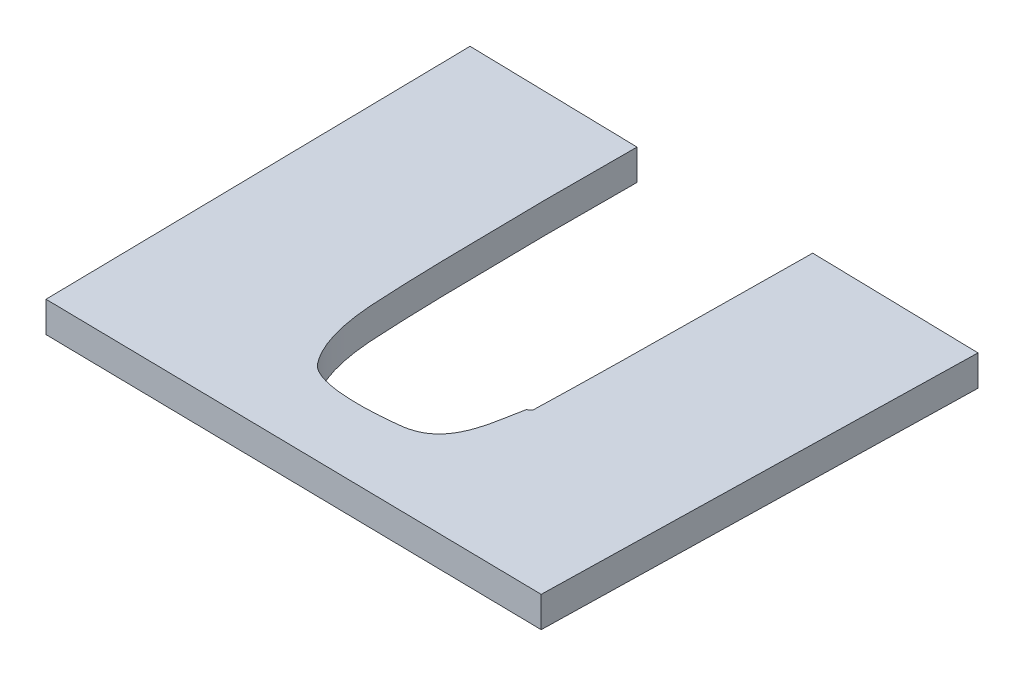
ISO-10303-21;
HEADER;
FILE_DESCRIPTION(('STEP AP214'),'2;1');
FILE_NAME('part.step','',(''),(''),'','','');
FILE_SCHEMA(('AUTOMOTIVE_DESIGN { 1 0 10303 214 1 1 1 1 }'));
ENDSEC;
DATA;
#1=APPLICATION_CONTEXT('core data for automotive mechanical design processes');
#2=APPLICATION_PROTOCOL_DEFINITION('international standard','automotive_design',2000,#1);
#3=PRODUCT_CONTEXT('',#1,'mechanical');
#4=PRODUCT('Part','Part','',(#3));
#5=PRODUCT_RELATED_PRODUCT_CATEGORY('part','',(#4));
#6=PRODUCT_DEFINITION_FORMATION('','',#4);
#7=PRODUCT_DEFINITION_CONTEXT('part definition',#1,'design');
#8=PRODUCT_DEFINITION('design','',#6,#7);
#9=PRODUCT_DEFINITION_SHAPE('','',#8);
#10=(LENGTH_UNIT() NAMED_UNIT(*) SI_UNIT(.MILLI.,.METRE.));
#11=(NAMED_UNIT(*) PLANE_ANGLE_UNIT() SI_UNIT($,.RADIAN.));
#12=(NAMED_UNIT(*) SI_UNIT($,.STERADIAN.) SOLID_ANGLE_UNIT());
#13=UNCERTAINTY_MEASURE_WITH_UNIT(LENGTH_MEASURE(1.E-05),#10,'distance_accuracy_value','');
#14=(GEOMETRIC_REPRESENTATION_CONTEXT(3) GLOBAL_UNCERTAINTY_ASSIGNED_CONTEXT((#13)) GLOBAL_UNIT_ASSIGNED_CONTEXT((#10,
#11,#12)) REPRESENTATION_CONTEXT('',''));
#15=CARTESIAN_POINT('',(0.,0.,0.));
#16=DIRECTION('',(0.,0.,1.));
#17=DIRECTION('',(1.,0.,0.));
#18=AXIS2_PLACEMENT_3D('',#15,#16,#17);
#19=CARTESIAN_POINT('',(88.3389714618213,1.,24.135500369023));
#20=DIRECTION('',(0.999866385580923,0.,-0.0163465894100423));
#21=DIRECTION('',(-0.0163465894100423,0.,-0.999866385580923));
#22=AXIS2_PLACEMENT_3D('',#19,#20,#21);
#23=PLANE('',#22);
#24=DIRECTION('',(0.0163465894100423,0.,0.999866385580923));
#25=VECTOR('',#24,1.);
#26=CARTESIAN_POINT('',(88.3389714618213,1.,24.135500369023));
#27=LINE('',#26,#25);
#28=CARTESIAN_POINT('',(88.1089001034624,1.,10.0628022827376));
#29=VERTEX_POINT('',#28);
#30=CARTESIAN_POINT('',(88.3389714618213,1.,24.135500369023));
#31=VERTEX_POINT('',#30);
#32=EDGE_CURVE('E107',#29,#31,#27,.T.);
#33=ORIENTED_EDGE('',*,*,#32,.F.);
#34=DIRECTION('',(0.,-1.,0.));
#35=VECTOR('',#34,1.);
#36=CARTESIAN_POINT('',(88.1089001034624,1.,10.0628022827376));
#37=LINE('',#36,#35);
#38=CARTESIAN_POINT('',(88.1089001034624,0.,10.0628022827376));
#39=VERTEX_POINT('',#38);
#40=EDGE_CURVE('E94',#29,#39,#37,.T.);
#41=ORIENTED_EDGE('',*,*,#40,.T.);
#42=DIRECTION('',(0.0163465894100423,0.,0.999866385580923));
#43=VECTOR('',#42,1.);
#44=CARTESIAN_POINT('',(88.3389714618213,0.,24.135500369023));
#45=LINE('',#44,#43);
#46=CARTESIAN_POINT('',(88.3389714618213,0.,24.135500369023));
#47=VERTEX_POINT('',#46);
#48=EDGE_CURVE('E102',#39,#47,#45,.T.);
#49=ORIENTED_EDGE('',*,*,#48,.T.);
#50=DIRECTION('',(0.,-1.,0.));
#51=VECTOR('',#50,1.);
#52=CARTESIAN_POINT('',(88.3389714618213,1.,24.135500369023));
#53=LINE('',#52,#51);
#54=EDGE_CURVE('E115',#31,#47,#53,.T.);
#55=ORIENTED_EDGE('',*,*,#54,.F.);
#56=EDGE_LOOP('',(#33,#41,#49,#55));
#57=FACE_BOUND('',#56,.T.);
#58=ADVANCED_FACE('F39',(#57),#23,.F.);
#59=CARTESIAN_POINT('',(62.4947593620138,1.,-34.1363669338565));
#60=DIRECTION('',(0.,1.,0.));
#61=DIRECTION('',(0.,0.,1.));
#62=AXIS2_PLACEMENT_3D('',#59,#60,#61);
#63=PLANE('',#62);
#64=DIRECTION('',(0.99975317783161,0.,0.022216737285147));
#65=VECTOR('',#64,1.);
#66=CARTESIAN_POINT('',(106.088763042082,1.,10.4623547924847));
#67=LINE('',#66,#65);
#68=CARTESIAN_POINT('',(93.6838427640256,1.,10.1866898974168));
#69=VERTEX_POINT('',#68);
#70=EDGE_CURVE('E58',#29,#69,#67,.T.);
#71=ORIENTED_EDGE('',*,*,#70,.F.);
#72=ORIENTED_EDGE('',*,*,#32,.T.);
#73=DIRECTION('',(0.999874047483599,0.,0.0158710166267237));
#74=VECTOR('',#73,1.);
#75=CARTESIAN_POINT('',(104.764673512498,1.,24.3962257983988));
#76=LINE('',#75,#74);
#77=CARTESIAN_POINT('',(104.764673512498,1.,24.3962257983988));
#78=VERTEX_POINT('',#77);
#79=EDGE_CURVE('E118',#31,#78,#76,.T.);
#80=ORIENTED_EDGE('',*,*,#79,.T.);
#81=DIRECTION('',(0.0217339954092151,0.,-0.999763788823916));
#82=VECTOR('',#81,1.);
#83=CARTESIAN_POINT('',(105.155761656561,1.,6.40617117146744));
#84=LINE('',#83,#82);
#85=CARTESIAN_POINT('',(105.06807683688,1.,10.4396728768135));
#86=VERTEX_POINT('',#85);
#87=EDGE_CURVE('E122',#78,#86,#84,.T.);
#88=ORIENTED_EDGE('',*,*,#87,.T.);
#89=CARTESIAN_POINT('',(99.5501649249814,1.,10.3170526121047));
#90=VERTEX_POINT('',#89);
#91=EDGE_CURVE('E112',#90,#86,#67,.T.);
#92=ORIENTED_EDGE('',*,*,#91,.F.);
#93=CARTESIAN_POINT('',(93.6838427640256,1.,10.1866898974168));
#94=CARTESIAN_POINT('',(93.6838427640256,1.,11.359954329608));
#95=CARTESIAN_POINT('',(93.6663333047441,1.,12.5333494221294));
#96=CARTESIAN_POINT('',(93.6838427640256,1.,13.7064831939903));
#97=CARTESIAN_POINT('',(93.7097908086668,1.,15.4450021849541));
#98=CARTESIAN_POINT('',(93.7140616561399,1.,17.1851655235641));
#99=CARTESIAN_POINT('',(93.8142054787135,1.,18.9209917815066));
#100=CARTESIAN_POINT('',(93.8620093253018,1.,19.7495917890368));
#101=CARTESIAN_POINT('',(94.0420349080543,1.,20.8353125017816));
#102=CARTESIAN_POINT('',(94.5963817668409,1.,21.5282460752648));
#103=CARTESIAN_POINT('',(95.1899686480391,1.,22.2702296767625));
#104=CARTESIAN_POINT('',(97.6585200006946,1.,21.9273222495673));
#105=CARTESIAN_POINT('',(97.7250869193507,1.,21.9193342193285));
#106=CARTESIAN_POINT('',(99.0317960926545,1.,21.7625291185321));
#107=CARTESIAN_POINT('',(99.1050513823907,1.,20.3643832063327));
#108=CARTESIAN_POINT('',(99.2894394956056,1.,19.4424426402583));
#109=CARTESIAN_POINT('',(99.3014915328419,1.,19.3821824540767));
#110=CARTESIAN_POINT('',(99.418047110142,1.,19.3735084308724));
#111=CARTESIAN_POINT('',(99.4198022102935,1.,19.3120799255704));
#112=CARTESIAN_POINT('',(99.5054431849838,1.,16.3146458114124));
#113=CARTESIAN_POINT('',(99.5067106867521,1.,13.3153950499266));
#114=CARTESIAN_POINT('',(99.5501649249814,1.,10.3170526121047));
#115=B_SPLINE_CURVE_WITH_KNOTS('',3,(#93,#94,#95,#96,#97,#98,#99,#100,#101,#102,#103,#104,#105,
#106,#107,#108,#109,#110,#111,#112,#113,#114),.UNSPECIFIED.,.F.,.F.,(4,3,3,3,3,3,3,4),(0.,1.,2.,
3.,4.,5.,6.,7.),.UNSPECIFIED.);
#116=EDGE_CURVE('E42',#69,#90,#115,.T.);
#117=ORIENTED_EDGE('',*,*,#116,.F.);
#118=EDGE_LOOP('',(#71,#72,#80,#88,#92,#117));
#119=FACE_BOUND('',#118,.T.);
#120=ADVANCED_FACE('F106',(#119),#63,.T.);
#121=CARTESIAN_POINT('',(62.4947593620138,0.,-34.1363669338565));
#122=DIRECTION('',(0.,1.,0.));
#123=DIRECTION('',(0.,0.,1.));
#124=AXIS2_PLACEMENT_3D('',#121,#122,#123);
#125=PLANE('',#124);
#126=ORIENTED_EDGE('',*,*,#48,.F.);
#127=DIRECTION('',(0.99975317783161,0.,0.022216737285147));
#128=VECTOR('',#127,1.);
#129=CARTESIAN_POINT('',(61.5256831162066,0.,9.47206412746524));
#130=LINE('',#129,#128);
#131=CARTESIAN_POINT('',(93.6838427640256,0.,10.1866898974168));
#132=VERTEX_POINT('',#131);
#133=EDGE_CURVE('E97',#39,#132,#130,.T.);
#134=ORIENTED_EDGE('',*,*,#133,.T.);
#135=CARTESIAN_POINT('',(93.6838427640256,0.,10.1866898974168));
#136=CARTESIAN_POINT('',(93.6838427640256,0.,11.359954329608));
#137=CARTESIAN_POINT('',(93.6663333047441,0.,12.5333494221294));
#138=CARTESIAN_POINT('',(93.6838427640256,0.,13.7064831939903));
#139=CARTESIAN_POINT('',(93.7097908086668,0.,15.4450021849541));
#140=CARTESIAN_POINT('',(93.7140616561399,0.,17.1851655235641));
#141=CARTESIAN_POINT('',(93.8142054787135,0.,18.9209917815066));
#142=CARTESIAN_POINT('',(93.8620093253018,0.,19.7495917890368));
#143=CARTESIAN_POINT('',(94.0420349080543,0.,20.8353125017816));
#144=CARTESIAN_POINT('',(94.5963817668409,0.,21.5282460752648));
#145=CARTESIAN_POINT('',(95.1899686480391,0.,22.2702296767625));
#146=CARTESIAN_POINT('',(97.6585200006946,0.,21.9273222495673));
#147=CARTESIAN_POINT('',(97.7250869193507,0.,21.9193342193285));
#148=CARTESIAN_POINT('',(99.0317960926545,0.,21.7625291185321));
#149=CARTESIAN_POINT('',(99.1050513823907,0.,20.3643832063327));
#150=CARTESIAN_POINT('',(99.2894394956056,0.,19.4424426402583));
#151=CARTESIAN_POINT('',(99.3014915328419,0.,19.3821824540767));
#152=CARTESIAN_POINT('',(99.418047110142,0.,19.3735084308724));
#153=CARTESIAN_POINT('',(99.4198022102935,0.,19.3120799255704));
#154=CARTESIAN_POINT('',(99.5054431849838,0.,16.3146458114124));
#155=CARTESIAN_POINT('',(99.5067106867521,0.,13.3153950499266));
#156=CARTESIAN_POINT('',(99.5501649249814,0.,10.3170526121047));
#157=B_SPLINE_CURVE_WITH_KNOTS('',3,(#135,#136,#137,#138,#139,#140,#141,#142,#143,#144,#145,
#146,#147,#148,#149,#150,#151,#152,#153,#154,#155,#156),.UNSPECIFIED.,.F.,.F.,(4,3,3,3,3,3,3,4),
(0.,1.,2.,3.,4.,5.,6.,7.),.UNSPECIFIED.);
#158=CARTESIAN_POINT('',(99.5501649249814,0.,10.3170526121047));
#159=VERTEX_POINT('',#158);
#160=EDGE_CURVE('E128',#132,#159,#157,.T.);
#161=ORIENTED_EDGE('',*,*,#160,.T.);
#162=CARTESIAN_POINT('',(105.06807683688,0.,10.4396728768135));
#163=VERTEX_POINT('',#162);
#164=EDGE_CURVE('E66',#159,#163,#130,.T.);
#165=ORIENTED_EDGE('',*,*,#164,.T.);
#166=DIRECTION('',(0.0217339954092151,0.,-0.999763788823916));
#167=VECTOR('',#166,1.);
#168=CARTESIAN_POINT('',(105.155761656561,0.,6.40617117146744));
#169=LINE('',#168,#167);
#170=CARTESIAN_POINT('',(104.764673512498,0.,24.3962257983988));
#171=VERTEX_POINT('',#170);
#172=EDGE_CURVE('E145',#171,#163,#169,.T.);
#173=ORIENTED_EDGE('',*,*,#172,.F.);
#174=DIRECTION('',(0.999874047483599,0.,0.0158710166267237));
#175=VECTOR('',#174,1.);
#176=CARTESIAN_POINT('',(104.764673512498,0.,24.3962257983988));
#177=LINE('',#176,#175);
#178=EDGE_CURVE('E133',#47,#171,#177,.T.);
#179=ORIENTED_EDGE('',*,*,#178,.F.);
#180=EDGE_LOOP('',(#126,#134,#161,#165,#173,#179));
#181=FACE_BOUND('',#180,.T.);
#182=ADVANCED_FACE('F167',(#181),#125,.F.);
#183=CARTESIAN_POINT('',(104.764673512498,1.,24.3962257983988));
#184=DIRECTION('',(0.0158710166267237,0.,-0.999874047483599));
#185=DIRECTION('',(-0.999874047483599,0.,-0.0158710166267237));
#186=AXIS2_PLACEMENT_3D('',#183,#184,#185);
#187=PLANE('',#186);
#188=ORIENTED_EDGE('',*,*,#178,.T.);
#189=DIRECTION('',(0.,-1.,0.));
#190=VECTOR('',#189,1.);
#191=CARTESIAN_POINT('',(104.764673512498,1.,24.3962257983988));
#192=LINE('',#191,#190);
#193=EDGE_CURVE('E149',#78,#171,#192,.T.);
#194=ORIENTED_EDGE('',*,*,#193,.F.);
#195=ORIENTED_EDGE('',*,*,#79,.F.);
#196=ORIENTED_EDGE('',*,*,#54,.T.);
#197=EDGE_LOOP('',(#188,#194,#195,#196));
#198=FACE_BOUND('',#197,.T.);
#199=ADVANCED_FACE('F169',(#198),#187,.F.);
#200=CARTESIAN_POINT('',(105.155761656561,1.,6.40617117146744));
#201=DIRECTION('',(-0.999763788823916,0.,-0.0217339954092151));
#202=DIRECTION('',(-0.0217339954092151,0.,0.999763788823916));
#203=AXIS2_PLACEMENT_3D('',#200,#201,#202);
#204=PLANE('',#203);
#205=ORIENTED_EDGE('',*,*,#172,.T.);
#206=DIRECTION('',(0.,1.,0.));
#207=VECTOR('',#206,1.);
#208=CARTESIAN_POINT('',(105.06807683688,1.,10.4396728768135));
#209=LINE('',#208,#207);
#210=EDGE_CURVE('E155',#163,#86,#209,.T.);
#211=ORIENTED_EDGE('',*,*,#210,.T.);
#212=ORIENTED_EDGE('',*,*,#87,.F.);
#213=ORIENTED_EDGE('',*,*,#193,.T.);
#214=EDGE_LOOP('',(#205,#211,#212,#213));
#215=FACE_BOUND('',#214,.T.);
#216=ADVANCED_FACE('F163',(#215),#204,.F.);
#217=DIRECTION('',(0.,-1.,0.));
#218=VECTOR('',#217,1.);
#219=SURFACE_OF_LINEAR_EXTRUSION('',#115,#218);
#220=ORIENTED_EDGE('',*,*,#160,.F.);
#221=DIRECTION('',(0.,-1.,0.));
#222=VECTOR('',#221,1.);
#223=CARTESIAN_POINT('',(93.6838427640256,1.,10.1866898974168));
#224=LINE('',#223,#222);
#225=EDGE_CURVE('E11',#69,#132,#224,.T.);
#226=ORIENTED_EDGE('',*,*,#225,.F.);
#227=ORIENTED_EDGE('',*,*,#116,.T.);
#228=DIRECTION('',(0.,-1.,0.));
#229=VECTOR('',#228,1.);
#230=CARTESIAN_POINT('',(99.5501649249814,1.,10.3170526121047));
#231=LINE('',#230,#229);
#232=EDGE_CURVE('E51',#90,#159,#231,.T.);
#233=ORIENTED_EDGE('',*,*,#232,.T.);
#234=EDGE_LOOP('',(#220,#226,#227,#233));
#235=FACE_BOUND('',#234,.T.);
#236=ADVANCED_FACE('F176',(#235),#219,.T.);
#237=CARTESIAN_POINT('',(106.088763042082,-9.,10.4623547924847));
#238=DIRECTION('',(-0.022216737285147,0.,0.99975317783161));
#239=DIRECTION('',(0.99975317783161,0.,0.022216737285147));
#240=AXIS2_PLACEMENT_3D('',#237,#238,#239);
#241=PLANE('',#240);
#242=ORIENTED_EDGE('',*,*,#164,.F.);
#243=ORIENTED_EDGE('',*,*,#232,.F.);
#244=ORIENTED_EDGE('',*,*,#91,.T.);
#245=ORIENTED_EDGE('',*,*,#210,.F.);
#246=EDGE_LOOP('',(#242,#243,#244,#245));
#247=FACE_BOUND('',#246,.T.);
#248=ADVANCED_FACE('F161',(#247),#241,.F.);
#249=ORIENTED_EDGE('',*,*,#70,.T.);
#250=ORIENTED_EDGE('',*,*,#225,.T.);
#251=ORIENTED_EDGE('',*,*,#133,.F.);
#252=ORIENTED_EDGE('',*,*,#40,.F.);
#253=EDGE_LOOP('',(#249,#250,#251,#252));
#254=FACE_BOUND('',#253,.T.);
#255=ADVANCED_FACE('F95',(#254),#241,.F.);
#256=CLOSED_SHELL('',(#58,#120,#182,#199,#216,#236,#248,#255));
#257=MANIFOLD_SOLID_BREP('B2',#256);
#258=ADVANCED_BREP_SHAPE_REPRESENTATION('',(#18,#257),#14);
#259=SHAPE_DEFINITION_REPRESENTATION(#9,#258);
ENDSEC;
END-ISO-10303-21;
